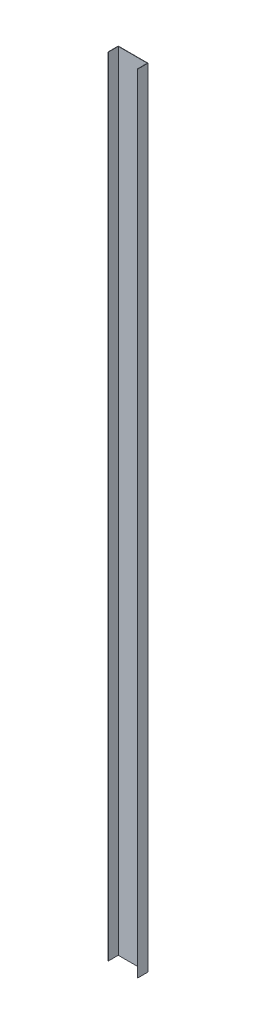
ISO-10303-21;
HEADER;
FILE_DESCRIPTION(('STEP AP214'),'2;1');
FILE_NAME('part.step','',(''),(''),'','','');
FILE_SCHEMA(('AUTOMOTIVE_DESIGN { 1 0 10303 214 1 1 1 1 }'));
ENDSEC;
DATA;
#1=APPLICATION_CONTEXT('core data for automotive mechanical design processes');
#2=APPLICATION_PROTOCOL_DEFINITION('international standard','automotive_design',2000,#1);
#3=PRODUCT_CONTEXT('',#1,'mechanical');
#4=PRODUCT('Part','Part','',(#3));
#5=PRODUCT_RELATED_PRODUCT_CATEGORY('part','',(#4));
#6=PRODUCT_DEFINITION_FORMATION('','',#4);
#7=PRODUCT_DEFINITION_CONTEXT('part definition',#1,'design');
#8=PRODUCT_DEFINITION('design','',#6,#7);
#9=PRODUCT_DEFINITION_SHAPE('','',#8);
#10=(LENGTH_UNIT() NAMED_UNIT(*) SI_UNIT(.MILLI.,.METRE.));
#11=(NAMED_UNIT(*) PLANE_ANGLE_UNIT() SI_UNIT($,.RADIAN.));
#12=(NAMED_UNIT(*) SI_UNIT($,.STERADIAN.) SOLID_ANGLE_UNIT());
#13=UNCERTAINTY_MEASURE_WITH_UNIT(LENGTH_MEASURE(1.E-05),#10,'distance_accuracy_value','');
#14=(GEOMETRIC_REPRESENTATION_CONTEXT(3) GLOBAL_UNCERTAINTY_ASSIGNED_CONTEXT((#13)) GLOBAL_UNIT_ASSIGNED_CONTEXT((#10,
#11,#12)) REPRESENTATION_CONTEXT('',''));
#15=CARTESIAN_POINT('',(0.,0.,0.));
#16=DIRECTION('',(0.,0.,1.));
#17=DIRECTION('',(1.,0.,0.));
#18=AXIS2_PLACEMENT_3D('',#15,#16,#17);
#19=CARTESIAN_POINT('',(-46.0375,2438.4,15.875));
#20=DIRECTION('',(0.,0.,-1.));
#21=DIRECTION('',(-1.,0.,0.));
#22=AXIS2_PLACEMENT_3D('',#19,#20,#21);
#23=PLANE('',#22);
#24=DIRECTION('',(0.,1.,0.));
#25=VECTOR('',#24,1.);
#26=CARTESIAN_POINT('',(45.0375,2438.4,15.875));
#27=LINE('',#26,#25);
#28=CARTESIAN_POINT('',(45.0375,0.,15.875));
#29=VERTEX_POINT('',#28);
#30=CARTESIAN_POINT('',(45.0375,2438.4,15.875));
#31=VERTEX_POINT('',#30);
#32=EDGE_CURVE('E120',#29,#31,#27,.T.);
#33=ORIENTED_EDGE('',*,*,#32,.F.);
#34=DIRECTION('',(1.,0.,0.));
#35=VECTOR('',#34,1.);
#36=CARTESIAN_POINT('',(-46.0375,0.,15.875));
#37=LINE('',#36,#35);
#38=CARTESIAN_POINT('',(46.0375,0.,15.875));
#39=VERTEX_POINT('',#38);
#40=EDGE_CURVE('E86',#29,#39,#37,.T.);
#41=ORIENTED_EDGE('',*,*,#40,.T.);
#42=DIRECTION('',(0.,-1.,0.));
#43=VECTOR('',#42,1.);
#44=CARTESIAN_POINT('',(46.0375,2438.4,15.875));
#45=LINE('',#44,#43);
#46=CARTESIAN_POINT('',(46.0375,2438.4,15.875));
#47=VERTEX_POINT('',#46);
#48=EDGE_CURVE('E166',#47,#39,#45,.T.);
#49=ORIENTED_EDGE('',*,*,#48,.F.);
#50=DIRECTION('',(1.,0.,0.));
#51=VECTOR('',#50,1.);
#52=CARTESIAN_POINT('',(-46.0375,2438.4,15.875));
#53=LINE('',#52,#51);
#54=EDGE_CURVE('E64',#31,#47,#53,.T.);
#55=ORIENTED_EDGE('',*,*,#54,.F.);
#56=EDGE_LOOP('',(#33,#41,#49,#55));
#57=FACE_BOUND('',#56,.T.);
#58=ADVANCED_FACE('F39',(#57),#23,.F.);
#59=DIRECTION('',(0.,-1.,0.));
#60=VECTOR('',#59,1.);
#61=CARTESIAN_POINT('',(-45.0375,2438.4,15.875));
#62=LINE('',#61,#60);
#63=CARTESIAN_POINT('',(-45.0375,2438.4,15.875));
#64=VERTEX_POINT('',#63);
#65=CARTESIAN_POINT('',(-45.0375,0.,15.875));
#66=VERTEX_POINT('',#65);
#67=EDGE_CURVE('E55',#64,#66,#62,.T.);
#68=ORIENTED_EDGE('',*,*,#67,.F.);
#69=CARTESIAN_POINT('',(-46.0375,2438.4,15.875));
#70=VERTEX_POINT('',#69);
#71=EDGE_CURVE('E163',#70,#64,#53,.T.);
#72=ORIENTED_EDGE('',*,*,#71,.F.);
#73=DIRECTION('',(0.,-1.,0.));
#74=VECTOR('',#73,1.);
#75=CARTESIAN_POINT('',(-46.0375,2438.4,15.875));
#76=LINE('',#75,#74);
#77=CARTESIAN_POINT('',(-46.0375,0.,15.875));
#78=VERTEX_POINT('',#77);
#79=EDGE_CURVE('E181',#70,#78,#76,.T.);
#80=ORIENTED_EDGE('',*,*,#79,.T.);
#81=EDGE_CURVE('E157',#78,#66,#37,.T.);
#82=ORIENTED_EDGE('',*,*,#81,.T.);
#83=EDGE_LOOP('',(#68,#72,#80,#82));
#84=FACE_BOUND('',#83,.T.);
#85=ADVANCED_FACE('F204',(#84),#23,.F.);
#86=CARTESIAN_POINT('',(0.,2438.4,0.));
#87=DIRECTION('',(0.,1.,0.));
#88=DIRECTION('',(0.,0.,1.));
#89=AXIS2_PLACEMENT_3D('',#86,#87,#88);
#90=PLANE('',#89);
#91=DIRECTION('',(-1.,0.,0.));
#92=VECTOR('',#91,1.);
#93=CARTESIAN_POINT('',(-45.0375,2438.4,-14.875));
#94=LINE('',#93,#92);
#95=CARTESIAN_POINT('',(45.0375,2438.4,-14.875));
#96=VERTEX_POINT('',#95);
#97=CARTESIAN_POINT('',(-45.0375,2438.4,-14.875));
#98=VERTEX_POINT('',#97);
#99=EDGE_CURVE('E123',#96,#98,#94,.T.);
#100=ORIENTED_EDGE('',*,*,#99,.F.);
#101=DIRECTION('',(0.,0.,-1.));
#102=VECTOR('',#101,1.);
#103=CARTESIAN_POINT('',(45.0375,2438.4,16.875));
#104=LINE('',#103,#102);
#105=EDGE_CURVE('E115',#31,#96,#104,.T.);
#106=ORIENTED_EDGE('',*,*,#105,.F.);
#107=ORIENTED_EDGE('',*,*,#54,.T.);
#108=DIRECTION('',(0.,0.,-1.));
#109=VECTOR('',#108,1.);
#110=CARTESIAN_POINT('',(46.0375,2438.4,-15.875));
#111=LINE('',#110,#109);
#112=CARTESIAN_POINT('',(46.0375,2438.4,-15.875));
#113=VERTEX_POINT('',#112);
#114=EDGE_CURVE('E154',#47,#113,#111,.T.);
#115=ORIENTED_EDGE('',*,*,#114,.T.);
#116=DIRECTION('',(-1.,0.,0.));
#117=VECTOR('',#116,1.);
#118=CARTESIAN_POINT('',(-46.0375,2438.4,-15.875));
#119=LINE('',#118,#117);
#120=CARTESIAN_POINT('',(-46.0375,2438.4,-15.875));
#121=VERTEX_POINT('',#120);
#122=EDGE_CURVE('E94',#113,#121,#119,.T.);
#123=ORIENTED_EDGE('',*,*,#122,.T.);
#124=DIRECTION('',(0.,0.,1.));
#125=VECTOR('',#124,1.);
#126=CARTESIAN_POINT('',(-46.0375,2438.4,-15.875));
#127=LINE('',#126,#125);
#128=EDGE_CURVE('E160',#121,#70,#127,.T.);
#129=ORIENTED_EDGE('',*,*,#128,.T.);
#130=ORIENTED_EDGE('',*,*,#71,.T.);
#131=DIRECTION('',(0.,0.,1.));
#132=VECTOR('',#131,1.);
#133=CARTESIAN_POINT('',(-45.0375,2438.4,16.875));
#134=LINE('',#133,#132);
#135=EDGE_CURVE('E137',#98,#64,#134,.T.);
#136=ORIENTED_EDGE('',*,*,#135,.F.);
#137=EDGE_LOOP('',(#100,#106,#107,#115,#123,#129,#130,#136));
#138=FACE_BOUND('',#137,.T.);
#139=ADVANCED_FACE('F135',(#138),#90,.T.);
#140=CARTESIAN_POINT('',(0.,0.,0.));
#141=DIRECTION('',(0.,1.,0.));
#142=DIRECTION('',(0.,0.,1.));
#143=AXIS2_PLACEMENT_3D('',#140,#141,#142);
#144=PLANE('',#143);
#145=DIRECTION('',(0.,0.,1.));
#146=VECTOR('',#145,1.);
#147=CARTESIAN_POINT('',(45.0375,0.,0.));
#148=LINE('',#147,#146);
#149=CARTESIAN_POINT('',(45.0375,0.,-14.875));
#150=VERTEX_POINT('',#149);
#151=EDGE_CURVE('E11',#150,#29,#148,.T.);
#152=ORIENTED_EDGE('',*,*,#151,.F.);
#153=DIRECTION('',(-1.,0.,0.));
#154=VECTOR('',#153,1.);
#155=CARTESIAN_POINT('',(-45.0375,0.,-14.875));
#156=LINE('',#155,#154);
#157=CARTESIAN_POINT('',(-45.0375,0.,-14.875));
#158=VERTEX_POINT('',#157);
#159=EDGE_CURVE('E130',#150,#158,#156,.T.);
#160=ORIENTED_EDGE('',*,*,#159,.T.);
#161=DIRECTION('',(0.,0.,1.));
#162=VECTOR('',#161,1.);
#163=CARTESIAN_POINT('',(-45.0375,0.,16.875));
#164=LINE('',#163,#162);
#165=EDGE_CURVE('E124',#158,#66,#164,.T.);
#166=ORIENTED_EDGE('',*,*,#165,.T.);
#167=ORIENTED_EDGE('',*,*,#81,.F.);
#168=DIRECTION('',(0.,0.,1.));
#169=VECTOR('',#168,1.);
#170=CARTESIAN_POINT('',(-46.0375,0.,-15.875));
#171=LINE('',#170,#169);
#172=CARTESIAN_POINT('',(-46.0375,0.,-15.875));
#173=VERTEX_POINT('',#172);
#174=EDGE_CURVE('E173',#173,#78,#171,.T.);
#175=ORIENTED_EDGE('',*,*,#174,.F.);
#176=DIRECTION('',(-1.,0.,0.));
#177=VECTOR('',#176,1.);
#178=CARTESIAN_POINT('',(-46.0375,0.,-15.875));
#179=LINE('',#178,#177);
#180=CARTESIAN_POINT('',(46.0375,0.,-15.875));
#181=VERTEX_POINT('',#180);
#182=EDGE_CURVE('E170',#181,#173,#179,.T.);
#183=ORIENTED_EDGE('',*,*,#182,.F.);
#184=DIRECTION('',(0.,0.,-1.));
#185=VECTOR('',#184,1.);
#186=CARTESIAN_POINT('',(46.0375,0.,-15.875));
#187=LINE('',#186,#185);
#188=EDGE_CURVE('E153',#39,#181,#187,.T.);
#189=ORIENTED_EDGE('',*,*,#188,.F.);
#190=ORIENTED_EDGE('',*,*,#40,.F.);
#191=EDGE_LOOP('',(#152,#160,#166,#167,#175,#183,#189,#190));
#192=FACE_BOUND('',#191,.T.);
#193=ADVANCED_FACE('F195',(#192),#144,.F.);
#194=CARTESIAN_POINT('',(46.0375,2438.4,-15.875));
#195=DIRECTION('',(-1.,0.,0.));
#196=DIRECTION('',(0.,0.,1.));
#197=AXIS2_PLACEMENT_3D('',#194,#195,#196);
#198=PLANE('',#197);
#199=ORIENTED_EDGE('',*,*,#188,.T.);
#200=DIRECTION('',(0.,-1.,0.));
#201=VECTOR('',#200,1.);
#202=CARTESIAN_POINT('',(46.0375,2438.4,-15.875));
#203=LINE('',#202,#201);
#204=EDGE_CURVE('E48',#113,#181,#203,.T.);
#205=ORIENTED_EDGE('',*,*,#204,.F.);
#206=ORIENTED_EDGE('',*,*,#114,.F.);
#207=ORIENTED_EDGE('',*,*,#48,.T.);
#208=EDGE_LOOP('',(#199,#205,#206,#207));
#209=FACE_BOUND('',#208,.T.);
#210=ADVANCED_FACE('F41',(#209),#198,.F.);
#211=CARTESIAN_POINT('',(-46.0375,2438.4,-15.875));
#212=DIRECTION('',(0.,0.,1.));
#213=DIRECTION('',(1.,0.,0.));
#214=AXIS2_PLACEMENT_3D('',#211,#212,#213);
#215=PLANE('',#214);
#216=ORIENTED_EDGE('',*,*,#182,.T.);
#217=DIRECTION('',(0.,-1.,0.));
#218=VECTOR('',#217,1.);
#219=CARTESIAN_POINT('',(-46.0375,2438.4,-15.875));
#220=LINE('',#219,#218);
#221=EDGE_CURVE('E185',#121,#173,#220,.T.);
#222=ORIENTED_EDGE('',*,*,#221,.F.);
#223=ORIENTED_EDGE('',*,*,#122,.F.);
#224=ORIENTED_EDGE('',*,*,#204,.T.);
#225=EDGE_LOOP('',(#216,#222,#223,#224));
#226=FACE_BOUND('',#225,.T.);
#227=ADVANCED_FACE('F190',(#226),#215,.F.);
#228=CARTESIAN_POINT('',(-46.0375,2438.4,-15.875));
#229=DIRECTION('',(1.,0.,0.));
#230=DIRECTION('',(0.,0.,-1.));
#231=AXIS2_PLACEMENT_3D('',#228,#229,#230);
#232=PLANE('',#231);
#233=ORIENTED_EDGE('',*,*,#174,.T.);
#234=ORIENTED_EDGE('',*,*,#79,.F.);
#235=ORIENTED_EDGE('',*,*,#128,.F.);
#236=ORIENTED_EDGE('',*,*,#221,.T.);
#237=EDGE_LOOP('',(#233,#234,#235,#236));
#238=FACE_BOUND('',#237,.T.);
#239=ADVANCED_FACE('F200',(#238),#232,.F.);
#240=CARTESIAN_POINT('',(45.0375,2438.4,16.875));
#241=DIRECTION('',(-1.,0.,0.));
#242=DIRECTION('',(0.,0.,1.));
#243=AXIS2_PLACEMENT_3D('',#240,#241,#242);
#244=PLANE('',#243);
#245=ORIENTED_EDGE('',*,*,#32,.T.);
#246=ORIENTED_EDGE('',*,*,#105,.T.);
#247=DIRECTION('',(0.,-1.,0.));
#248=VECTOR('',#247,1.);
#249=CARTESIAN_POINT('',(45.0375,2438.4,-14.875));
#250=LINE('',#249,#248);
#251=EDGE_CURVE('E118',#96,#150,#250,.T.);
#252=ORIENTED_EDGE('',*,*,#251,.T.);
#253=ORIENTED_EDGE('',*,*,#151,.T.);
#254=EDGE_LOOP('',(#245,#246,#252,#253));
#255=FACE_BOUND('',#254,.T.);
#256=ADVANCED_FACE('F117',(#255),#244,.T.);
#257=CARTESIAN_POINT('',(-45.0375,2438.4,16.875));
#258=DIRECTION('',(1.,0.,0.));
#259=DIRECTION('',(0.,0.,-1.));
#260=AXIS2_PLACEMENT_3D('',#257,#258,#259);
#261=PLANE('',#260);
#262=ORIENTED_EDGE('',*,*,#67,.T.);
#263=ORIENTED_EDGE('',*,*,#165,.F.);
#264=DIRECTION('',(0.,-1.,0.));
#265=VECTOR('',#264,1.);
#266=CARTESIAN_POINT('',(-45.0375,2438.4,-14.875));
#267=LINE('',#266,#265);
#268=EDGE_CURVE('E132',#98,#158,#267,.T.);
#269=ORIENTED_EDGE('',*,*,#268,.F.);
#270=ORIENTED_EDGE('',*,*,#135,.T.);
#271=EDGE_LOOP('',(#262,#263,#269,#270));
#272=FACE_BOUND('',#271,.T.);
#273=ADVANCED_FACE('F261',(#272),#261,.T.);
#274=CARTESIAN_POINT('',(-45.0375,2438.4,-14.875));
#275=DIRECTION('',(0.,0.,1.));
#276=DIRECTION('',(1.,0.,0.));
#277=AXIS2_PLACEMENT_3D('',#274,#275,#276);
#278=PLANE('',#277);
#279=ORIENTED_EDGE('',*,*,#159,.F.);
#280=ORIENTED_EDGE('',*,*,#251,.F.);
#281=ORIENTED_EDGE('',*,*,#99,.T.);
#282=ORIENTED_EDGE('',*,*,#268,.T.);
#283=EDGE_LOOP('',(#279,#280,#281,#282));
#284=FACE_BOUND('',#283,.T.);
#285=ADVANCED_FACE('F127',(#284),#278,.T.);
#286=CLOSED_SHELL('',(#58,#85,#139,#193,#210,#227,#239,#256,#273,#285));
#287=MANIFOLD_SOLID_BREP('B2',#286);
#288=ADVANCED_BREP_SHAPE_REPRESENTATION('',(#18,#287),#14);
#289=SHAPE_DEFINITION_REPRESENTATION(#9,#288);
ENDSEC;
END-ISO-10303-21;
